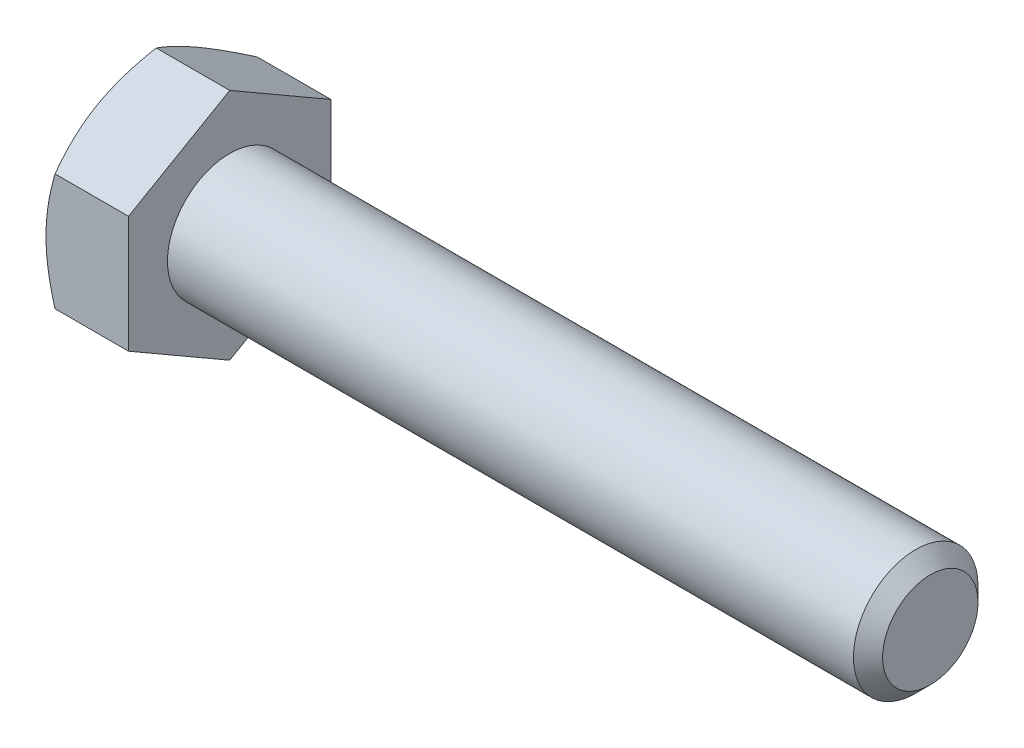
ISO-10303-21;
HEADER;
FILE_DESCRIPTION(('STEP AP214'),'2;1');
FILE_NAME('part.step','',(''),(''),'','','');
FILE_SCHEMA(('AUTOMOTIVE_DESIGN { 1 0 10303 214 1 1 1 1 }'));
ENDSEC;
DATA;
#1=APPLICATION_CONTEXT('core data for automotive mechanical design processes');
#2=APPLICATION_PROTOCOL_DEFINITION('international standard','automotive_design',2000,#1);
#3=PRODUCT_CONTEXT('',#1,'mechanical');
#4=PRODUCT('Part','Part','',(#3));
#5=PRODUCT_RELATED_PRODUCT_CATEGORY('part','',(#4));
#6=PRODUCT_DEFINITION_FORMATION('','',#4);
#7=PRODUCT_DEFINITION_CONTEXT('part definition',#1,'design');
#8=PRODUCT_DEFINITION('design','',#6,#7);
#9=PRODUCT_DEFINITION_SHAPE('','',#8);
#10=(LENGTH_UNIT() NAMED_UNIT(*) SI_UNIT(.MILLI.,.METRE.));
#11=(NAMED_UNIT(*) PLANE_ANGLE_UNIT() SI_UNIT($,.RADIAN.));
#12=(NAMED_UNIT(*) SI_UNIT($,.STERADIAN.) SOLID_ANGLE_UNIT());
#13=UNCERTAINTY_MEASURE_WITH_UNIT(LENGTH_MEASURE(1.E-05),#10,'distance_accuracy_value','');
#14=(GEOMETRIC_REPRESENTATION_CONTEXT(3) GLOBAL_UNCERTAINTY_ASSIGNED_CONTEXT((#13)) GLOBAL_UNIT_ASSIGNED_CONTEXT((#10,
#11,#12)) REPRESENTATION_CONTEXT('',''));
#15=CARTESIAN_POINT('',(0.,0.,0.));
#16=DIRECTION('',(0.,0.,1.));
#17=DIRECTION('',(1.,0.,0.));
#18=AXIS2_PLACEMENT_3D('',#15,#16,#17);
#19=CARTESIAN_POINT('',(-25.15,3.75277674973256,-6.5));
#20=DIRECTION('',(0.,0.,1.));
#21=DIRECTION('',(0.,-1.,0.));
#22=AXIS2_PLACEMENT_3D('',#19,#20,#21);
#23=PLANE('',#22);
#24=CARTESIAN_POINT('',(-21.8988375347904,-10.2428264448742,-6.5));
#25=CARTESIAN_POINT('',(-22.0378959568298,-9.95749123914051,-6.5));
#26=CARTESIAN_POINT('',(-22.1756670766775,-9.67151814089467,-6.5));
#27=CARTESIAN_POINT('',(-22.4479137007926,-9.09795746903658,-6.5));
#28=CARTESIAN_POINT('',(-22.5823887155004,-8.81036966330045,-6.5));
#29=CARTESIAN_POINT('',(-22.8479641385984,-8.23183597545905,-6.5));
#30=CARTESIAN_POINT('',(-22.9790435500319,-7.94088042259019,-6.5));
#31=CARTESIAN_POINT('',(-23.2360498001633,-7.35671087199066,-6.5));
#32=CARTESIAN_POINT('',(-23.3619768720535,-7.06349697718675,-6.5));
#33=CARTESIAN_POINT('',(-23.6114858396513,-6.4643492082911,-6.5));
#34=CARTESIAN_POINT('',(-23.7348431675994,-6.15832132148372,-6.5));
#35=CARTESIAN_POINT('',(-23.972608752086,-5.54274557657454,-6.5));
#36=CARTESIAN_POINT('',(-24.0870160276455,-5.23319733686813,-6.5));
#37=CARTESIAN_POINT('',(-24.3039973091502,-4.61061796093426,-6.5));
#38=CARTESIAN_POINT('',(-24.4065939138988,-4.29759477651377,-6.5));
#39=CARTESIAN_POINT('',(-24.5967687655389,-3.66705774167675,-6.5));
#40=CARTESIAN_POINT('',(-24.6843515728703,-3.34954528670966,-6.5));
#41=CARTESIAN_POINT('',(-24.8399427735025,-2.7116231594821,-6.5));
#42=CARTESIAN_POINT('',(-24.9080609404154,-2.39124068505769,-6.5));
#43=CARTESIAN_POINT('',(-25.0209643239007,-1.74628166899206,-6.5));
#44=CARTESIAN_POINT('',(-25.0657520879383,-1.4217055892218,-6.5));
#45=CARTESIAN_POINT('',(-25.1124703115096,-0.935153679865167,-6.5));
#46=CARTESIAN_POINT('',(-25.1246175505238,-0.774120709459425,-6.5));
#47=CARTESIAN_POINT('',(-25.1420902736854,-0.45167794746219,-6.5));
#48=CARTESIAN_POINT('',(-25.1474158757718,-0.290268162433766,-6.5));
#49=CARTESIAN_POINT('',(-25.1511103242405,0.0326315494834262,-6.5));
#50=CARTESIAN_POINT('',(-25.1494791334757,0.194121476795526,-6.5));
#51=CARTESIAN_POINT('',(-25.1393035354648,0.516885665892433,-6.5));
#52=CARTESIAN_POINT('',(-25.1307588135452,0.678159917525946,-6.5));
#53=CARTESIAN_POINT('',(-25.1024625394136,1.06087214104236,-6.5));
#54=CARTESIAN_POINT('',(-25.0797022251754,1.28209274970583,-6.5));
#55=CARTESIAN_POINT('',(-25.0223779071898,1.72298724409095,-6.5));
#56=CARTESIAN_POINT('',(-24.9878124366177,1.94266093413999,-6.5));
#57=CARTESIAN_POINT('',(-24.8682333769037,2.59905068849274,-6.5));
#58=CARTESIAN_POINT('',(-24.7673552447204,3.03292018726935,-6.5));
#59=CARTESIAN_POINT('',(-24.5911776385598,3.68203059846041,-6.5));
#60=CARTESIAN_POINT('',(-24.5274324340808,3.90060192791518,-6.5));
#61=CARTESIAN_POINT('',(-24.3930131704256,4.33562456943628,-6.5));
#62=CARTESIAN_POINT('',(-24.3223390575691,4.55207586506382,-6.5));
#63=CARTESIAN_POINT('',(-24.1752213498623,4.98292314894179,-6.5));
#64=CARTESIAN_POINT('',(-24.0987793659087,5.19731969234534,-6.5));
#65=CARTESIAN_POINT('',(-23.941056055445,5.62431367555165,-6.5));
#66=CARTESIAN_POINT('',(-23.8597748415995,5.83691115710786,-6.5));
#67=CARTESIAN_POINT('',(-23.6339612470781,6.41107024223244,-6.5));
#68=CARTESIAN_POINT('',(-23.4855374016011,6.7710999393646,-6.5));
#69=CARTESIAN_POINT('',(-23.1799136760887,7.4874289427614,-6.5));
#70=CARTESIAN_POINT('',(-23.0227128050824,7.84372782238265,-6.5));
#71=CARTESIAN_POINT('',(-22.7016207293392,8.55345570158046,-6.5));
#72=CARTESIAN_POINT('',(-22.5377269335731,8.90688352497398,-6.5));
#73=CARTESIAN_POINT('',(-22.204856755394,9.61131133342873,-6.5));
#74=CARTESIAN_POINT('',(-22.0358805841306,9.96231141860833,-6.5));
#75=CARTESIAN_POINT('',(-21.6936782330391,10.662937159309,-6.5));
#76=CARTESIAN_POINT('',(-21.5204455845689,11.012559648688,-6.5));
#77=CARTESIAN_POINT('',(-21.1708226067091,11.7102232163488,-6.5));
#78=CARTESIAN_POINT('',(-20.9944322504893,12.058264281162,-6.5));
#79=CARTESIAN_POINT('',(-20.6391563125904,12.7529700638115,-6.5));
#80=CARTESIAN_POINT('',(-20.4602713019335,13.099635074022,-6.5));
#81=CARTESIAN_POINT('',(-20.1004354194784,13.7918918665457,-6.5));
#82=CARTESIAN_POINT('',(-19.919484539364,14.1374836445314,-6.5));
#83=CARTESIAN_POINT('',(-19.4128202969978,15.099399814329,-6.5));
#84=CARTESIAN_POINT('',(-19.0852517304161,15.7147468097596,-6.5));
#85=CARTESIAN_POINT('',(-18.4261876636577,16.9433793144053,-6.5));
#86=CARTESIAN_POINT('',(-18.0946919178251,17.5566646915471,-6.5));
#87=CARTESIAN_POINT('',(-17.4299128254685,18.779571101851,-6.5));
#88=CARTESIAN_POINT('',(-17.0966393541487,19.3891975085091,-6.5));
#89=CARTESIAN_POINT('',(-16.4278601843398,20.6071616325274,-6.5));
#90=CARTESIAN_POINT('',(-16.0923546667948,21.2154994492026,-6.5));
#91=CARTESIAN_POINT('',(-15.7560387557676,21.8233856137376,-6.5));
#92=B_SPLINE_CURVE_WITH_KNOTS('',3,(#24,#25,#26,#27,#28,#29,#30,#31,#32,#33,#34,#35,#36,#37,#38,
#39,#40,#41,#42,#43,#44,#45,#46,#47,#48,#49,#50,#51,#52,#53,#54,#55,#56,#57,#58,#59,#60,#61,#62,
#63,#64,#65,#66,#67,#68,#69,#70,#71,#72,#73,#74,#75,#76,#77,#78,#79,#80,#81,#82,#83,#84,#85,#86,
#87,#88,#89,#90,#91),.UNSPECIFIED.,.F.,.F.,(4,2,2,2,2,2,2,2,2,2,2,2,2,2,2,2,2,2,2,2,2,2,2,2,2,2,
2,2,2,2,2,2,2,4),(0.,0.952261280954758,1.90466315142592,2.86198011748919,3.81925370781654,
4.8090096155403,5.79887385484699,6.78681142619052,7.77444837777728,8.75640022308114,
9.73824482580219,10.2225937503397,10.7069343008766,11.1912774376491,11.6756426208366,
12.3424346364353,13.0093095330214,14.3437044199063,15.0266742020638,15.7096492758005,
16.3924343039017,17.0752034419144,18.2433007736227,19.4115302572279,20.580216365918,
21.7488539878951,22.9193933559163,24.0899426744252,25.2602283161706,26.4305186706516,
28.5218066724742,30.6132261881502,32.6975528607151,34.7817125747728),.UNSPECIFIED.);
#93=CARTESIAN_POINT('',(-24.5694434163992,3.75277674973256,-6.5));
#94=VERTEX_POINT('',#93);
#95=CARTESIAN_POINT('',(-25.15,0.,-6.5));
#96=VERTEX_POINT('',#95);
#97=EDGE_CURVE('E235',#94,#96,#92,.F.);
#98=ORIENTED_EDGE('',*,*,#97,.F.);
#99=DIRECTION('',(1.,0.,0.));
#100=VECTOR('',#99,1.);
#101=CARTESIAN_POINT('',(-25.15,3.75277674973256,-6.5));
#102=LINE('',#101,#100);
#103=CARTESIAN_POINT('',(-19.85,3.75277674973256,-6.5));
#104=VERTEX_POINT('',#103);
#105=EDGE_CURVE('E262',#94,#104,#102,.T.);
#106=ORIENTED_EDGE('',*,*,#105,.T.);
#107=DIRECTION('',(0.,-1.,0.));
#108=VECTOR('',#107,1.);
#109=CARTESIAN_POINT('',(-19.85,3.75277674973256,-6.5));
#110=LINE('',#109,#108);
#111=CARTESIAN_POINT('',(-19.85,-3.75277674973257,-6.5));
#112=VERTEX_POINT('',#111);
#113=EDGE_CURVE('E241',#104,#112,#110,.T.);
#114=ORIENTED_EDGE('',*,*,#113,.T.);
#115=DIRECTION('',(1.,0.,0.));
#116=VECTOR('',#115,1.);
#117=CARTESIAN_POINT('',(-25.15,-3.75277674973257,-6.5));
#118=LINE('',#117,#116);
#119=CARTESIAN_POINT('',(-24.5694434163992,-3.75277674973257,-6.5));
#120=VERTEX_POINT('',#119);
#121=EDGE_CURVE('E218',#120,#112,#118,.T.);
#122=ORIENTED_EDGE('',*,*,#121,.F.);
#123=EDGE_CURVE('E159',#96,#120,#92,.F.);
#124=ORIENTED_EDGE('',*,*,#123,.F.);
#125=EDGE_LOOP('',(#98,#106,#114,#122,#124));
#126=FACE_BOUND('',#125,.T.);
#127=ADVANCED_FACE('F35',(#126),#23,.F.);
#128=CARTESIAN_POINT('',(-25.15,-3.75277674973257,-6.5));
#129=DIRECTION('',(0.,0.866025403784439,0.5));
#130=DIRECTION('',(0.,-0.5,0.866025403784439));
#131=AXIS2_PLACEMENT_3D('',#128,#129,#130);
#132=PLANE('',#131);
#133=CARTESIAN_POINT('',(-24.5693767481941,-3.75266127967873,-6.5002));
#134=CARTESIAN_POINT('',(-24.6169955769245,-3.83515161912751,-6.35732254094112));
#135=CARTESIAN_POINT('',(-24.6624532993973,-3.91794952254313,-6.21391236546509));
#136=CARTESIAN_POINT('',(-24.748451317977,-4.08421773795795,-5.92592736868281));
#137=CARTESIAN_POINT('',(-24.788989492772,-4.16768832359106,-5.78135207342874));
#138=CARTESIAN_POINT('',(-24.9024289988768,-4.41943655294052,-5.34531134947997));
#139=CARTESIAN_POINT('',(-24.9669521928713,-4.5887079340369,-5.05212471715368));
#140=CARTESIAN_POINT('',(-25.0426134164525,-4.84201947708215,-4.61337625445563));
#141=CARTESIAN_POINT('',(-25.064167143543,-4.92530276780316,-4.46912536350531));
#142=CARTESIAN_POINT('',(-25.1003096853939,-5.09224566542477,-4.17997178286191));
#143=CARTESIAN_POINT('',(-25.1148991155403,-5.17590523841628,-4.03506915190111));
#144=CARTESIAN_POINT('',(-25.1367412474927,-5.34336968579964,-3.74501222057168));
#145=CARTESIAN_POINT('',(-25.1440022756779,-5.427174286676,-3.59985839394579));
#146=CARTESIAN_POINT('',(-25.1510396974178,-5.59485627940484,-3.30942466302505));
#147=CARTESIAN_POINT('',(-25.1508163221878,-5.6787336689286,-3.16414476276364));
#148=CARTESIAN_POINT('',(-25.1399165414848,-5.90853103021317,-2.76612405757351));
#149=CARTESIAN_POINT('',(-25.1216181821306,-6.05437578112763,-2.51351353897243));
#150=CARTESIAN_POINT('',(-25.0635936585423,-6.34509659313135,-2.00997032176432));
#151=CARTESIAN_POINT('',(-25.0238476614618,-6.48997163178545,-1.75903939406692));
#152=CARTESIAN_POINT('',(-24.9244940967979,-6.78127752911039,-1.25448277935568));
#153=CARTESIAN_POINT('',(-24.864465574362,-6.92767163007068,-1.00092075856408));
#154=CARTESIAN_POINT('',(-24.7282250074901,-7.21827667013277,-0.497578064240953));
#155=CARTESIAN_POINT('',(-24.6520449658364,-7.36249133098589,-0.247790944447034));
#156=CARTESIAN_POINT('',(-24.5693767481941,-7.50566896951897,0.000200000000002895));
#157=B_SPLINE_CURVE_WITH_KNOTS('',3,(#133,#134,#135,#136,#137,#138,#139,#140,#141,#142,#143,
#144,#145,#146,#147,#148,#149,#150,#151,#152,#153,#154,#155,#156),.UNSPECIFIED.,.F.,.F.,(4,2,2,
2,2,2,2,2,2,2,2,4),(0.,0.515105052395588,1.03043143507525,2.06322554824262,2.56697389547996,
3.07067772176454,3.57380860368928,4.0769239424252,4.9527935470566,5.82947446853466,
6.72559912449736,7.61996451221046),.UNSPECIFIED.);
#158=CARTESIAN_POINT('',(-25.15,-5.62916512459885,-3.25));
#159=VERTEX_POINT('',#158);
#160=EDGE_CURVE('E240',#120,#159,#157,.T.);
#161=ORIENTED_EDGE('',*,*,#160,.F.);
#162=ORIENTED_EDGE('',*,*,#121,.T.);
#163=DIRECTION('',(0.,-0.5,0.866025403784439));
#164=VECTOR('',#163,1.);
#165=CARTESIAN_POINT('',(-19.85,-3.75277674973257,-6.5));
#166=LINE('',#165,#164);
#167=CARTESIAN_POINT('',(-19.85,-7.50555349946514,0.));
#168=VERTEX_POINT('',#167);
#169=EDGE_CURVE('E272',#112,#168,#166,.T.);
#170=ORIENTED_EDGE('',*,*,#169,.T.);
#171=DIRECTION('',(1.,0.,0.));
#172=VECTOR('',#171,1.);
#173=CARTESIAN_POINT('',(-25.15,-7.50555349946514,0.));
#174=LINE('',#173,#172);
#175=CARTESIAN_POINT('',(-24.5694434163992,-7.50555349946514,0.));
#176=VERTEX_POINT('',#175);
#177=EDGE_CURVE('E222',#176,#168,#174,.T.);
#178=ORIENTED_EDGE('',*,*,#177,.F.);
#179=EDGE_CURVE('E178',#159,#176,#157,.T.);
#180=ORIENTED_EDGE('',*,*,#179,.F.);
#181=EDGE_LOOP('',(#161,#162,#170,#178,#180));
#182=FACE_BOUND('',#181,.T.);
#183=ADVANCED_FACE('F188',(#182),#132,.F.);
#184=CARTESIAN_POINT('',(-25.15,-7.50555349946514,0.));
#185=DIRECTION('',(0.,0.866025403784439,-0.5));
#186=DIRECTION('',(0.,0.5,0.866025403784439));
#187=AXIS2_PLACEMENT_3D('',#184,#185,#186);
#188=PLANE('',#187);
#189=CARTESIAN_POINT('',(-24.5693767481941,-7.50566896951897,-0.000199999999996506));
#190=CARTESIAN_POINT('',(-24.6169955769245,-7.4231786300702,0.142677459058884));
#191=CARTESIAN_POINT('',(-24.6624532993973,-7.34038072665458,0.286087634534916));
#192=CARTESIAN_POINT('',(-24.748451317977,-7.17411251123976,0.574072631317198));
#193=CARTESIAN_POINT('',(-24.788989492772,-7.09064192560665,0.718647926571267));
#194=CARTESIAN_POINT('',(-24.9024289988768,-6.83889369625719,1.15468865052004));
#195=CARTESIAN_POINT('',(-24.9669521928713,-6.66962231516081,1.44787528284632));
#196=CARTESIAN_POINT('',(-25.0426134164525,-6.41631077211555,1.88662374554438));
#197=CARTESIAN_POINT('',(-25.064167143543,-6.33302748139454,2.03087463649469));
#198=CARTESIAN_POINT('',(-25.1003096853939,-6.16608458377293,2.32002821713809));
#199=CARTESIAN_POINT('',(-25.1148991155403,-6.08242501078143,2.46493084809889));
#200=CARTESIAN_POINT('',(-25.1367412474927,-5.91496056339806,2.75498777942832));
#201=CARTESIAN_POINT('',(-25.1440022756779,-5.8311559625217,2.90014160605421));
#202=CARTESIAN_POINT('',(-25.1510396974178,-5.66347396979287,3.19057533697495));
#203=CARTESIAN_POINT('',(-25.1508163221878,-5.5795965802691,3.33585523723636));
#204=CARTESIAN_POINT('',(-25.1399165414848,-5.34979921898453,3.7338759424265));
#205=CARTESIAN_POINT('',(-25.1216181821306,-5.20395446807007,3.98648646102757));
#206=CARTESIAN_POINT('',(-25.0635936585423,-4.91323365606636,4.49002967823568));
#207=CARTESIAN_POINT('',(-25.0238476614618,-4.76835861741226,4.74096060593309));
#208=CARTESIAN_POINT('',(-24.9244940967978,-4.47705272008732,5.24551722064432));
#209=CARTESIAN_POINT('',(-24.864465574362,-4.33065861912703,5.49907924143591));
#210=CARTESIAN_POINT('',(-24.7282250074901,-4.04005357906494,6.00242193575905));
#211=CARTESIAN_POINT('',(-24.6520449658364,-3.89583891821182,6.25220905555297));
#212=CARTESIAN_POINT('',(-24.5693767481941,-3.75266127967873,6.5002));
#213=B_SPLINE_CURVE_WITH_KNOTS('',3,(#189,#190,#191,#192,#193,#194,#195,#196,#197,#198,#199,
#200,#201,#202,#203,#204,#205,#206,#207,#208,#209,#210,#211,#212),.UNSPECIFIED.,.F.,.F.,(4,2,2,
2,2,2,2,2,2,2,2,4),(0.,0.515105052395587,1.03043143507524,2.06322554824262,2.56697389547996,
3.07067772176454,3.57380860368928,4.0769239424252,4.9527935470566,5.82947446853466,
6.72559912449736,7.61996451221045),.UNSPECIFIED.);
#214=CARTESIAN_POINT('',(-25.15,-5.62916512459885,3.25));
#215=VERTEX_POINT('',#214);
#216=EDGE_CURVE('E176',#176,#215,#213,.T.);
#217=ORIENTED_EDGE('',*,*,#216,.F.);
#218=ORIENTED_EDGE('',*,*,#177,.T.);
#219=DIRECTION('',(0.,0.5,0.866025403784439));
#220=VECTOR('',#219,1.);
#221=CARTESIAN_POINT('',(-19.85,-7.50555349946514,0.));
#222=LINE('',#221,#220);
#223=CARTESIAN_POINT('',(-19.85,-3.75277674973257,6.5));
#224=VERTEX_POINT('',#223);
#225=EDGE_CURVE('E255',#168,#224,#222,.T.);
#226=ORIENTED_EDGE('',*,*,#225,.T.);
#227=DIRECTION('',(1.,0.,0.));
#228=VECTOR('',#227,1.);
#229=CARTESIAN_POINT('',(-25.15,-3.75277674973257,6.5));
#230=LINE('',#229,#228);
#231=CARTESIAN_POINT('',(-24.5694434163994,-3.75277674973285,6.5));
#232=VERTEX_POINT('',#231);
#233=EDGE_CURVE('E252',#232,#224,#230,.T.);
#234=ORIENTED_EDGE('',*,*,#233,.F.);
#235=EDGE_CURVE('E170',#215,#232,#213,.T.);
#236=ORIENTED_EDGE('',*,*,#235,.F.);
#237=EDGE_LOOP('',(#217,#218,#226,#234,#236));
#238=FACE_BOUND('',#237,.T.);
#239=ADVANCED_FACE('F184',(#238),#188,.F.);
#240=CARTESIAN_POINT('',(-25.15,-3.75277674973257,6.5));
#241=DIRECTION('',(0.,0.,-1.));
#242=DIRECTION('',(0.,1.,0.));
#243=AXIS2_PLACEMENT_3D('',#240,#241,#242);
#244=PLANE('',#243);
#245=CARTESIAN_POINT('',(-21.898837531364,-10.242826451903,6.5));
#246=CARTESIAN_POINT('',(-22.0378959535461,-9.9574912459326,6.5));
#247=CARTESIAN_POINT('',(-22.1756670735365,-9.67151814744991,6.5));
#248=CARTESIAN_POINT('',(-22.4479136979362,-9.09795747511739,6.5));
#249=CARTESIAN_POINT('',(-22.582388712786,-8.81036966914369,6.5));
#250=CARTESIAN_POINT('',(-22.8479641361679,-8.2318359808236,6.5));
#251=CARTESIAN_POINT('',(-22.9790435477435,-7.9408804277136,6.5));
#252=CARTESIAN_POINT('',(-23.2360497981565,-7.35671087663017,6.5));
#253=CARTESIAN_POINT('',(-23.3619768701864,-7.0634969815835,6.5));
#254=CARTESIAN_POINT('',(-23.6114858380679,-6.46434921218302,6.5));
#255=CARTESIAN_POINT('',(-23.7348431661597,-6.15832132511338,6.5));
#256=CARTESIAN_POINT('',(-23.972608750926,-5.54274557967553,6.5));
#257=CARTESIAN_POINT('',(-24.0870160266216,-5.23319733970269,6.5));
#258=CARTESIAN_POINT('',(-24.3039973083856,-4.61061796323105,6.5));
#259=CARTESIAN_POINT('',(-24.4065939132575,-4.29759477853923,6.5));
#260=CARTESIAN_POINT('',(-24.5967687651243,-3.66705774315221,6.5));
#261=CARTESIAN_POINT('',(-24.6843515725591,-3.34954528790644,6.5));
#262=CARTESIAN_POINT('',(-24.8399427734003,-2.71162315998017,6.5));
#263=CARTESIAN_POINT('',(-24.9080609404108,-2.39124068513379,6.5));
#264=CARTESIAN_POINT('',(-25.0209643240282,-1.74628166821368,6.5));
#265=CARTESIAN_POINT('',(-25.0657520881001,-1.42170558801091,6.5));
#266=CARTESIAN_POINT('',(-25.1124703116654,-0.935153678008447,6.5));
#267=CARTESIAN_POINT('',(-25.1246175506682,-0.774120707390587,6.5));
#268=CARTESIAN_POINT('',(-25.1420902737883,-0.45167794496943,6.5));
#269=CARTESIAN_POINT('',(-25.1474158758445,-0.290268159729203,6.5));
#270=CARTESIAN_POINT('',(-25.1511103242345,0.032631552610058,6.5));
#271=CARTESIAN_POINT('',(-25.1494791334211,0.194121480132423,6.5));
#272=CARTESIAN_POINT('',(-25.1393035352959,0.516885669647161,6.5));
#273=CARTESIAN_POINT('',(-25.1307588133104,0.67815992148824,6.5));
#274=CARTESIAN_POINT('',(-25.1024625390171,1.06087214532241,6.5));
#275=CARTESIAN_POINT('',(-25.0797022246861,1.28209275409517,6.5));
#276=CARTESIAN_POINT('',(-25.0223779065099,1.72298724869384,6.5));
#277=CARTESIAN_POINT('',(-24.98781243584,1.94266093884714,6.5));
#278=CARTESIAN_POINT('',(-24.8682333758306,2.59905069350689,6.5));
#279=CARTESIAN_POINT('',(-24.7673552434479,3.03292019247994,6.5));
#280=CARTESIAN_POINT('',(-24.5911776369932,3.68203060396479,6.5));
#281=CARTESIAN_POINT('',(-24.5274324324155,3.90060193351963,6.5));
#282=CARTESIAN_POINT('',(-24.393013168566,4.33562457523974,6.5));
#283=CARTESIAN_POINT('',(-24.3223390556138,4.5520758709662,6.5));
#284=CARTESIAN_POINT('',(-24.1752213477193,4.98292315504125,6.5));
#285=CARTESIAN_POINT('',(-24.0987793636737,5.19731969854296,6.5));
#286=CARTESIAN_POINT('',(-23.941056053029,5.6243136819456,6.5));
#287=CARTESIAN_POINT('',(-23.8597748390948,5.83691116359998,6.5));
#288=CARTESIAN_POINT('',(-23.6339612444198,6.41107024877938,6.5));
#289=CARTESIAN_POINT('',(-23.485537398888,6.77109994587115,6.5));
#290=CARTESIAN_POINT('',(-23.179913673282,7.48742894919241,6.5));
#291=CARTESIAN_POINT('',(-23.0227128022369,7.84372782877851,6.5));
#292=CARTESIAN_POINT('',(-22.7016207264276,8.55345570790977,6.5));
#293=CARTESIAN_POINT('',(-22.5377269306343,8.90688353127188,6.5));
#294=CARTESIAN_POINT('',(-22.2048567524088,9.61131133966724,6.5));
#295=CARTESIAN_POINT('',(-22.0358805811264,9.96231142481885,6.5));
#296=CARTESIAN_POINT('',(-21.6936782300035,10.6629371654643,6.5));
#297=CARTESIAN_POINT('',(-21.5204455815211,11.0125596548161,6.5));
#298=CARTESIAN_POINT('',(-21.1708226036412,11.7102232224246,6.5));
#299=CARTESIAN_POINT('',(-20.9944322474136,12.0582642872127,6.5));
#300=CARTESIAN_POINT('',(-20.6391563095022,12.7529700698137,6.5));
#301=CARTESIAN_POINT('',(-20.4602712988407,13.0996350800009,6.5));
#302=CARTESIAN_POINT('',(-20.1004354163791,13.7918918724793,6.5));
#303=CARTESIAN_POINT('',(-19.9194845362626,14.1374836504429,6.5));
#304=CARTESIAN_POINT('',(-19.4128202938739,15.0993998202175,6.5));
#305=CARTESIAN_POINT('',(-19.0852517272737,15.7147468156481,6.5));
#306=CARTESIAN_POINT('',(-18.4261876604819,16.9433793202954,6.5));
#307=CARTESIAN_POINT('',(-18.0946919146346,17.5566646974389,6.5));
#308=CARTESIAN_POINT('',(-17.4299128222475,18.7795711077538,6.5));
#309=CARTESIAN_POINT('',(-17.0966393509119,19.3891975144212,6.5));
#310=CARTESIAN_POINT('',(-16.4278601810733,20.6071616384594,6.5));
#311=CARTESIAN_POINT('',(-16.0923546635142,21.215499455145,6.5));
#312=CARTESIAN_POINT('',(-15.7560387524736,21.8233856196907,6.5));
#313=B_SPLINE_CURVE_WITH_KNOTS('',3,(#245,#246,#247,#248,#249,#250,#251,#252,#253,#254,#255,
#256,#257,#258,#259,#260,#261,#262,#263,#264,#265,#266,#267,#268,#269,#270,#271,#272,#273,#274,
#275,#276,#277,#278,#279,#280,#281,#282,#283,#284,#285,#286,#287,#288,#289,#290,#291,#292,#293,
#294,#295,#296,#297,#298,#299,#300,#301,#302,#303,#304,#305,#306,#307,#308,#309,#310,#311,#312),
.UNSPECIFIED.,.F.,.F.,(4,2,2,2,2,2,2,2,2,2,2,2,2,2,2,2,2,2,2,2,2,2,2,2,2,2,2,2,2,2,2,2,2,4),(0.,
0.952261281780652,1.90466315307783,2.86198011997567,3.81925371113752,4.80900961975205,
5.79887385994981,6.78681143218155,7.77444838465583,8.75640023125627,9.73824483527201,
10.222593760441,10.7069343116093,11.1912774490135,11.6756426328327,12.3424346487859,
13.0093095457265,14.343704433322,15.0266742158507,15.7096492899588,16.3924343184303,
17.0752034568132,18.2433007884729,19.4115302720289,20.5802163806681,21.7488540025943,
22.9193933705589,24.0899426890111,25.2602283307008,26.4305186851261,28.5218066869747,
30.6132262026763,32.6975528752884,34.7817125893938),.UNSPECIFIED.);
#314=CARTESIAN_POINT('',(-25.15,0.,6.5));
#315=VERTEX_POINT('',#314);
#316=EDGE_CURVE('E177',#232,#315,#313,.T.);
#317=ORIENTED_EDGE('',*,*,#316,.F.);
#318=ORIENTED_EDGE('',*,*,#233,.T.);
#319=DIRECTION('',(0.,1.,0.));
#320=VECTOR('',#319,1.);
#321=CARTESIAN_POINT('',(-19.85,-3.75277674973257,6.5));
#322=LINE('',#321,#320);
#323=CARTESIAN_POINT('',(-19.85,3.75277674973257,6.5));
#324=VERTEX_POINT('',#323);
#325=EDGE_CURVE('E269',#224,#324,#322,.T.);
#326=ORIENTED_EDGE('',*,*,#325,.T.);
#327=DIRECTION('',(1.,0.,0.));
#328=VECTOR('',#327,1.);
#329=CARTESIAN_POINT('',(-25.15,3.75277674973257,6.5));
#330=LINE('',#329,#328);
#331=CARTESIAN_POINT('',(-24.5694434163992,3.75277674973257,6.5));
#332=VERTEX_POINT('',#331);
#333=EDGE_CURVE('E257',#332,#324,#330,.T.);
#334=ORIENTED_EDGE('',*,*,#333,.F.);
#335=EDGE_CURVE('E107',#315,#332,#313,.T.);
#336=ORIENTED_EDGE('',*,*,#335,.F.);
#337=EDGE_LOOP('',(#317,#318,#326,#334,#336));
#338=FACE_BOUND('',#337,.T.);
#339=ADVANCED_FACE('F187',(#338),#244,.F.);
#340=CARTESIAN_POINT('',(-25.15,3.75277674973257,6.5));
#341=DIRECTION('',(0.,-0.866025403784439,-0.5));
#342=DIRECTION('',(0.,0.5,-0.866025403784439));
#343=AXIS2_PLACEMENT_3D('',#340,#341,#342);
#344=PLANE('',#343);
#345=CARTESIAN_POINT('',(-24.5693767481941,3.75266127967873,6.5002));
#346=CARTESIAN_POINT('',(-24.6169955769245,3.8351516191275,6.35732254094112));
#347=CARTESIAN_POINT('',(-24.6624532993973,3.91794952254312,6.21391236546509));
#348=CARTESIAN_POINT('',(-24.748451317977,4.08421773795795,5.9259273686828));
#349=CARTESIAN_POINT('',(-24.788989492772,4.16768832359105,5.78135207342874));
#350=CARTESIAN_POINT('',(-24.9024289988768,4.41943655294051,5.34531134947996));
#351=CARTESIAN_POINT('',(-24.9669521928713,4.58870793403689,5.05212471715368));
#352=CARTESIAN_POINT('',(-25.0426134164525,4.84201947708215,4.61337625445563));
#353=CARTESIAN_POINT('',(-25.064167143543,4.92530276780316,4.46912536350531));
#354=CARTESIAN_POINT('',(-25.1003096853939,5.09224566542477,4.17997178286191));
#355=CARTESIAN_POINT('',(-25.1148991155403,5.17590523841627,4.03506915190111));
#356=CARTESIAN_POINT('',(-25.1367412474927,5.34336968579964,3.74501222057168));
#357=CARTESIAN_POINT('',(-25.1440022756779,5.427174286676,3.59985839394579));
#358=CARTESIAN_POINT('',(-25.1510396974178,5.59485627940483,3.30942466302505));
#359=CARTESIAN_POINT('',(-25.1508163221878,5.6787336689286,3.16414476276364));
#360=CARTESIAN_POINT('',(-25.1399165414848,5.90853103021317,2.7661240575735));
#361=CARTESIAN_POINT('',(-25.1216181821306,6.05437578112763,2.51351353897243));
#362=CARTESIAN_POINT('',(-25.0635936585423,6.34509659313134,2.00997032176432));
#363=CARTESIAN_POINT('',(-25.0238476614618,6.48997163178544,1.75903939406692));
#364=CARTESIAN_POINT('',(-24.9244940967979,6.78127752911038,1.25448277935568));
#365=CARTESIAN_POINT('',(-24.864465574362,6.92767163007067,1.00092075856409));
#366=CARTESIAN_POINT('',(-24.7282250074901,7.21827667013276,0.497578064240955));
#367=CARTESIAN_POINT('',(-24.6520449658364,7.36249133098589,0.247790944447036));
#368=CARTESIAN_POINT('',(-24.5693767481941,7.50566896951897,-0.000200000000000316));
#369=B_SPLINE_CURVE_WITH_KNOTS('',3,(#345,#346,#347,#348,#349,#350,#351,#352,#353,#354,#355,
#356,#357,#358,#359,#360,#361,#362,#363,#364,#365,#366,#367,#368),.UNSPECIFIED.,.F.,.F.,(4,2,2,
2,2,2,2,2,2,2,2,4),(0.,0.515105052395588,1.03043143507525,2.06322554824262,2.56697389547996,
3.07067772176454,3.57380860368928,4.0769239424252,4.9527935470566,5.82947446853466,
6.72559912449736,7.61996451221046),.UNSPECIFIED.);
#370=CARTESIAN_POINT('',(-25.15,5.62916512459885,3.25));
#371=VERTEX_POINT('',#370);
#372=EDGE_CURVE('E104',#332,#371,#369,.T.);
#373=ORIENTED_EDGE('',*,*,#372,.F.);
#374=ORIENTED_EDGE('',*,*,#333,.T.);
#375=DIRECTION('',(0.,0.5,-0.866025403784439));
#376=VECTOR('',#375,1.);
#377=CARTESIAN_POINT('',(-19.85,3.75277674973257,6.5));
#378=LINE('',#377,#376);
#379=CARTESIAN_POINT('',(-19.85,7.50555349946513,0.));
#380=VERTEX_POINT('',#379);
#381=EDGE_CURVE('E267',#324,#380,#378,.T.);
#382=ORIENTED_EDGE('',*,*,#381,.T.);
#383=DIRECTION('',(1.,0.,0.));
#384=VECTOR('',#383,1.);
#385=CARTESIAN_POINT('',(-25.15,7.50555349946513,0.));
#386=LINE('',#385,#384);
#387=CARTESIAN_POINT('',(-24.5694434163992,7.50555349946513,0.));
#388=VERTEX_POINT('',#387);
#389=EDGE_CURVE('E128',#388,#380,#386,.T.);
#390=ORIENTED_EDGE('',*,*,#389,.F.);
#391=EDGE_CURVE('E111',#371,#388,#369,.T.);
#392=ORIENTED_EDGE('',*,*,#391,.F.);
#393=EDGE_LOOP('',(#373,#374,#382,#390,#392));
#394=FACE_BOUND('',#393,.T.);
#395=ADVANCED_FACE('F126',(#394),#344,.F.);
#396=CARTESIAN_POINT('',(-25.15,7.50555349946513,0.));
#397=DIRECTION('',(0.,-0.866025403784439,0.5));
#398=DIRECTION('',(0.,-0.5,-0.866025403784439));
#399=AXIS2_PLACEMENT_3D('',#396,#397,#398);
#400=PLANE('',#399);
#401=CARTESIAN_POINT('',(-24.5693767481941,7.50566896951897,0.000199999999999783));
#402=CARTESIAN_POINT('',(-24.6169955769245,7.4231786300702,-0.14267745905888));
#403=CARTESIAN_POINT('',(-24.6624532993973,7.34038072665458,-0.286087634534913));
#404=CARTESIAN_POINT('',(-24.748451317977,7.17411251123975,-0.574072631317195));
#405=CARTESIAN_POINT('',(-24.788989492772,7.09064192560665,-0.718647926571264));
#406=CARTESIAN_POINT('',(-24.9024289988768,6.83889369625718,-1.15468865052003));
#407=CARTESIAN_POINT('',(-24.9669521928713,6.6696223151608,-1.44787528284632));
#408=CARTESIAN_POINT('',(-25.0426134164525,6.41631077211555,-1.88662374554437));
#409=CARTESIAN_POINT('',(-25.064167143543,6.33302748139454,-2.03087463649469));
#410=CARTESIAN_POINT('',(-25.1003096853939,6.16608458377293,-2.32002821713809));
#411=CARTESIAN_POINT('',(-25.1148991155403,6.08242501078143,-2.46493084809889));
#412=CARTESIAN_POINT('',(-25.1367412474927,5.91496056339806,-2.75498777942832));
#413=CARTESIAN_POINT('',(-25.1440022756779,5.8311559625217,-2.90014160605421));
#414=CARTESIAN_POINT('',(-25.1510396974178,5.66347396979286,-3.19057533697495));
#415=CARTESIAN_POINT('',(-25.1508163221878,5.5795965802691,-3.33585523723636));
#416=CARTESIAN_POINT('',(-25.1399165414848,5.34979921898453,-3.73387594242649));
#417=CARTESIAN_POINT('',(-25.1216181821306,5.20395446807007,-3.98648646102757));
#418=CARTESIAN_POINT('',(-25.0635936585423,4.91323365606635,-4.49002967823568));
#419=CARTESIAN_POINT('',(-25.0238476614618,4.76835861741226,-4.74096060593308));
#420=CARTESIAN_POINT('',(-24.9244940967979,4.47705272008731,-5.24551722064432));
#421=CARTESIAN_POINT('',(-24.864465574362,4.33065861912702,-5.49907924143592));
#422=CARTESIAN_POINT('',(-24.7282250074901,4.04005357906493,-6.00242193575905));
#423=CARTESIAN_POINT('',(-24.6520449658364,3.89583891821181,-6.25220905555297));
#424=CARTESIAN_POINT('',(-24.5693767481941,3.75266127967873,-6.5002));
#425=B_SPLINE_CURVE_WITH_KNOTS('',3,(#401,#402,#403,#404,#405,#406,#407,#408,#409,#410,#411,
#412,#413,#414,#415,#416,#417,#418,#419,#420,#421,#422,#423,#424),.UNSPECIFIED.,.F.,.F.,(4,2,2,
2,2,2,2,2,2,2,2,4),(0.,0.515105052395588,1.03043143507524,2.06322554824262,2.56697389547997,
3.07067772176454,3.57380860368928,4.0769239424252,4.9527935470566,5.82947446853467,
6.72559912449737,7.61996451221046),.UNSPECIFIED.);
#426=CARTESIAN_POINT('',(-25.15,5.62916512459885,-3.25));
#427=VERTEX_POINT('',#426);
#428=EDGE_CURVE('E117',#388,#427,#425,.T.);
#429=ORIENTED_EDGE('',*,*,#428,.F.);
#430=ORIENTED_EDGE('',*,*,#389,.T.);
#431=DIRECTION('',(0.,-0.5,-0.866025403784439));
#432=VECTOR('',#431,1.);
#433=CARTESIAN_POINT('',(-19.85,7.50555349946513,0.));
#434=LINE('',#433,#432);
#435=EDGE_CURVE('E264',#380,#104,#434,.T.);
#436=ORIENTED_EDGE('',*,*,#435,.T.);
#437=ORIENTED_EDGE('',*,*,#105,.F.);
#438=EDGE_CURVE('E123',#427,#94,#425,.T.);
#439=ORIENTED_EDGE('',*,*,#438,.F.);
#440=EDGE_LOOP('',(#429,#430,#436,#437,#439));
#441=FACE_BOUND('',#440,.T.);
#442=ADVANCED_FACE('F203',(#441),#400,.F.);
#443=CARTESIAN_POINT('',(-19.85,0.,0.));
#444=DIRECTION('',(1.,0.,0.));
#445=DIRECTION('',(0.,0.,-1.));
#446=AXIS2_PLACEMENT_3D('',#443,#444,#445);
#447=CYLINDRICAL_SURFACE('',#446,4.);
#448=CARTESIAN_POINT('',(24.2125,0.,0.));
#449=DIRECTION('',(1.,0.,0.));
#450=DIRECTION('',(0.,0.,-1.));
#451=AXIS2_PLACEMENT_3D('',#448,#449,#450);
#452=CIRCLE('',#451,4.);
#453=CARTESIAN_POINT('',(24.2125,0.,-4.));
#454=VERTEX_POINT('',#453);
#455=EDGE_CURVE('E212',#454,#454,#452,.F.);
#456=CARTESIAN_POINT('',(-19.85,0.,0.));
#457=DIRECTION('',(-1.,0.,0.));
#458=DIRECTION('',(0.,0.,1.));
#459=AXIS2_PLACEMENT_3D('',#456,#457,#458);
#460=CIRCLE('',#459,4.);
#461=CARTESIAN_POINT('',(-19.85,0.,-4.));
#462=VERTEX_POINT('',#461);
#463=EDGE_CURVE('E215',#462,#462,#460,.F.);
#464=CARTESIAN_POINT('',(24.2125,0.,-4.));
#465=CARTESIAN_POINT('',(23.753515625,0.,-4.));
#466=CARTESIAN_POINT('',(23.29453125,0.,-4.));
#467=CARTESIAN_POINT('',(22.3765625,0.,-4.));
#468=CARTESIAN_POINT('',(21.917578125,0.,-4.));
#469=CARTESIAN_POINT('',(20.999609375,0.,-4.));
#470=CARTESIAN_POINT('',(20.540625,0.,-4.));
#471=CARTESIAN_POINT('',(19.62265625,0.,-4.));
#472=CARTESIAN_POINT('',(19.163671875,0.,-4.));
#473=CARTESIAN_POINT('',(18.245703125,0.,-4.));
#474=CARTESIAN_POINT('',(17.78671875,0.,-4.));
#475=CARTESIAN_POINT('',(16.86875,0.,-4.));
#476=CARTESIAN_POINT('',(16.409765625,0.,-4.));
#477=CARTESIAN_POINT('',(15.491796875,0.,-4.));
#478=CARTESIAN_POINT('',(15.0328125,0.,-4.));
#479=CARTESIAN_POINT('',(14.11484375,0.,-4.));
#480=CARTESIAN_POINT('',(13.655859375,0.,-4.));
#481=CARTESIAN_POINT('',(12.737890625,0.,-4.));
#482=CARTESIAN_POINT('',(12.27890625,0.,-4.));
#483=CARTESIAN_POINT('',(11.3609375,0.,-4.));
#484=CARTESIAN_POINT('',(10.901953125,0.,-4.));
#485=CARTESIAN_POINT('',(9.983984375,0.,-4.));
#486=CARTESIAN_POINT('',(9.525,0.,-4.));
#487=CARTESIAN_POINT('',(8.60703125,0.,-4.));
#488=CARTESIAN_POINT('',(8.148046875,0.,-4.));
#489=CARTESIAN_POINT('',(7.230078125,0.,-4.));
#490=CARTESIAN_POINT('',(6.77109375,0.,-4.));
#491=CARTESIAN_POINT('',(5.853125,0.,-4.));
#492=CARTESIAN_POINT('',(5.394140625,0.,-4.));
#493=CARTESIAN_POINT('',(4.476171875,0.,-4.));
#494=CARTESIAN_POINT('',(4.0171875,0.,-4.));
#495=CARTESIAN_POINT('',(3.09921875,0.,-4.));
#496=CARTESIAN_POINT('',(2.640234375,0.,-4.));
#497=CARTESIAN_POINT('',(1.722265625,0.,-4.));
#498=CARTESIAN_POINT('',(1.26328125,0.,-4.));
#499=CARTESIAN_POINT('',(0.345312499999999,0.,-4.));
#500=CARTESIAN_POINT('',(-0.113671875000001,0.,-4.));
#501=CARTESIAN_POINT('',(-1.031640625,0.,-4.));
#502=CARTESIAN_POINT('',(-1.490625,0.,-4.));
#503=CARTESIAN_POINT('',(-2.40859375,0.,-4.));
#504=CARTESIAN_POINT('',(-2.867578125,0.,-4.));
#505=CARTESIAN_POINT('',(-3.785546875,0.,-4.));
#506=CARTESIAN_POINT('',(-4.24453125,0.,-4.));
#507=CARTESIAN_POINT('',(-5.1625,0.,-4.));
#508=CARTESIAN_POINT('',(-5.621484375,0.,-4.));
#509=CARTESIAN_POINT('',(-6.539453125,0.,-4.));
#510=CARTESIAN_POINT('',(-6.9984375,0.,-4.));
#511=CARTESIAN_POINT('',(-7.91640625,0.,-4.));
#512=CARTESIAN_POINT('',(-8.375390625,0.,-4.));
#513=CARTESIAN_POINT('',(-9.293359375,0.,-4.));
#514=CARTESIAN_POINT('',(-9.75234375,0.,-4.));
#515=CARTESIAN_POINT('',(-10.6703125,0.,-4.));
#516=CARTESIAN_POINT('',(-11.129296875,0.,-4.));
#517=CARTESIAN_POINT('',(-12.047265625,0.,-4.));
#518=CARTESIAN_POINT('',(-12.50625,0.,-4.));
#519=CARTESIAN_POINT('',(-13.42421875,0.,-4.));
#520=CARTESIAN_POINT('',(-13.883203125,0.,-4.));
#521=CARTESIAN_POINT('',(-14.801171875,0.,-4.));
#522=CARTESIAN_POINT('',(-15.26015625,0.,-4.));
#523=CARTESIAN_POINT('',(-16.178125,0.,-4.));
#524=CARTESIAN_POINT('',(-16.637109375,0.,-4.));
#525=CARTESIAN_POINT('',(-17.555078125,0.,-4.));
#526=CARTESIAN_POINT('',(-18.0140625,0.,-4.));
#527=CARTESIAN_POINT('',(-18.93203125,0.,-4.));
#528=CARTESIAN_POINT('',(-19.391015625,0.,-4.));
#529=CARTESIAN_POINT('',(-19.85,0.,-4.));
#530=B_SPLINE_CURVE_WITH_KNOTS('',3,(#464,#465,#466,#467,#468,#469,#470,#471,#472,#473,#474,
#475,#476,#477,#478,#479,#480,#481,#482,#483,#484,#485,#486,#487,#488,#489,#490,#491,#492,#493,
#494,#495,#496,#497,#498,#499,#500,#501,#502,#503,#504,#505,#506,#507,#508,#509,#510,#511,#512,
#513,#514,#515,#516,#517,#518,#519,#520,#521,#522,#523,#524,#525,#526,#527,#528,#529),
.UNSPECIFIED.,.F.,.F.,(4,2,2,2,2,2,2,2,2,2,2,2,2,2,2,2,2,2,2,2,2,2,2,2,2,2,2,2,2,2,2,2,4),(0.,
1.376953125,2.75390625,4.130859375,5.5078125,6.884765625,8.26171875,9.638671875,11.015625,
12.392578125,13.76953125,15.146484375,16.5234375,17.900390625,19.27734375,20.654296875,22.03125,
23.408203125,24.78515625,26.162109375,27.5390625,28.916015625,30.29296875,31.669921875,
33.046875,34.423828125,35.80078125,37.177734375,38.5546875,39.931640625,41.30859375,
42.685546875,44.0625),.UNSPECIFIED.);
#531=EDGE_CURVE('BSEAM200',#454,#462,#530,.T.);
#532=ORIENTED_EDGE('',*,*,#455,.T.);
#533=ORIENTED_EDGE('',*,*,#463,.T.);
#534=ORIENTED_EDGE('',*,*,#531,.T.);
#535=ORIENTED_EDGE('',*,*,#531,.F.);
#536=EDGE_LOOP('',(#532,#534,#533,#535));
#537=FACE_BOUND('',#536,.T.);
#538=ADVANCED_FACE('F200',(#537),#447,.T.);
#539=CARTESIAN_POINT('',(25.15,0.,0.));
#540=DIRECTION('',(1.,0.,0.));
#541=DIRECTION('',(0.,0.,-1.));
#542=AXIS2_PLACEMENT_3D('',#539,#540,#541);
#543=PLANE('',#542);
#544=CARTESIAN_POINT('',(25.15,0.,0.));
#545=DIRECTION('',(1.,0.,0.));
#546=DIRECTION('',(0.,0.,-1.));
#547=AXIS2_PLACEMENT_3D('',#544,#545,#546);
#548=CIRCLE('',#547,3.0625);
#549=CARTESIAN_POINT('',(25.15,0.,-3.0625));
#550=VERTEX_POINT('',#549);
#551=EDGE_CURVE('E217',#550,#550,#548,.T.);
#552=ORIENTED_EDGE('',*,*,#551,.T.);
#553=EDGE_LOOP('',(#552));
#554=FACE_BOUND('',#553,.T.);
#555=ADVANCED_FACE('F198',(#554),#543,.T.);
#556=CARTESIAN_POINT('',(25.15,0.,0.));
#557=DIRECTION('',(-1.,0.,0.));
#558=DIRECTION('',(0.,0.,1.));
#559=AXIS2_PLACEMENT_3D('',#556,#557,#558);
#560=CONICAL_SURFACE('',#559,3.0625,0.785398163397451);
#561=ORIENTED_EDGE('',*,*,#455,.F.);
#562=EDGE_LOOP('',(#561));
#563=FACE_BOUND('',#562,.T.);
#564=ORIENTED_EDGE('',*,*,#551,.F.);
#565=EDGE_LOOP('',(#564));
#566=FACE_BOUND('',#565,.T.);
#567=ADVANCED_FACE('F37',(#563,#566),#560,.T.);
#568=CARTESIAN_POINT('',(-19.85,-3.75277674973257,-6.5));
#569=DIRECTION('',(-1.,0.,0.));
#570=DIRECTION('',(0.,0.,1.));
#571=AXIS2_PLACEMENT_3D('',#568,#569,#570);
#572=PLANE('',#571);
#573=ORIENTED_EDGE('',*,*,#463,.F.);
#574=EDGE_LOOP('',(#573));
#575=FACE_BOUND('',#574,.T.);
#576=ORIENTED_EDGE('',*,*,#113,.F.);
#577=ORIENTED_EDGE('',*,*,#435,.F.);
#578=ORIENTED_EDGE('',*,*,#381,.F.);
#579=ORIENTED_EDGE('',*,*,#325,.F.);
#580=ORIENTED_EDGE('',*,*,#225,.F.);
#581=ORIENTED_EDGE('',*,*,#169,.F.);
#582=EDGE_LOOP('',(#576,#577,#578,#579,#580,#581));
#583=FACE_BOUND('',#582,.T.);
#584=ADVANCED_FACE('F278',(#575,#583),#572,.F.);
#585=CARTESIAN_POINT('',(-25.15,0.,0.));
#586=DIRECTION('',(1.,0.,0.));
#587=DIRECTION('',(0.,0.,1.));
#588=AXIS2_PLACEMENT_3D('',#585,#586,#587);
#589=CONICAL_SURFACE('',#588,6.5,1.0471975511966);
#590=ORIENTED_EDGE('',*,*,#235,.T.);
#591=ORIENTED_EDGE('',*,*,#316,.T.);
#592=CARTESIAN_POINT('',(-25.15,0.,0.));
#593=DIRECTION('',(-1.,0.,0.));
#594=DIRECTION('',(0.,0.,1.));
#595=AXIS2_PLACEMENT_3D('',#592,#593,#594);
#596=CIRCLE('',#595,6.5);
#597=EDGE_CURVE('E39',#215,#315,#596,.T.);
#598=ORIENTED_EDGE('',*,*,#597,.F.);
#599=EDGE_LOOP('',(#590,#591,#598));
#600=FACE_BOUND('',#599,.T.);
#601=ADVANCED_FACE('F247',(#600),#589,.T.);
#602=ORIENTED_EDGE('',*,*,#179,.T.);
#603=ORIENTED_EDGE('',*,*,#216,.T.);
#604=EDGE_CURVE('E225',#159,#215,#596,.T.);
#605=ORIENTED_EDGE('',*,*,#604,.F.);
#606=EDGE_LOOP('',(#602,#603,#605));
#607=FACE_BOUND('',#606,.T.);
#608=ADVANCED_FACE('F244',(#607),#589,.T.);
#609=ORIENTED_EDGE('',*,*,#123,.T.);
#610=ORIENTED_EDGE('',*,*,#160,.T.);
#611=EDGE_CURVE('E226',#96,#159,#596,.T.);
#612=ORIENTED_EDGE('',*,*,#611,.F.);
#613=EDGE_LOOP('',(#609,#610,#612));
#614=FACE_BOUND('',#613,.T.);
#615=ADVANCED_FACE('F153',(#614),#589,.T.);
#616=ORIENTED_EDGE('',*,*,#97,.T.);
#617=EDGE_CURVE('E44',#427,#96,#596,.T.);
#618=ORIENTED_EDGE('',*,*,#617,.F.);
#619=ORIENTED_EDGE('',*,*,#438,.T.);
#620=EDGE_LOOP('',(#616,#618,#619));
#621=FACE_BOUND('',#620,.T.);
#622=ADVANCED_FACE('F149',(#621),#589,.T.);
#623=ORIENTED_EDGE('',*,*,#391,.T.);
#624=ORIENTED_EDGE('',*,*,#428,.T.);
#625=EDGE_CURVE('E13',#371,#427,#596,.T.);
#626=ORIENTED_EDGE('',*,*,#625,.F.);
#627=EDGE_LOOP('',(#623,#624,#626));
#628=FACE_BOUND('',#627,.T.);
#629=ADVANCED_FACE('F115',(#628),#589,.T.);
#630=ORIENTED_EDGE('',*,*,#335,.T.);
#631=ORIENTED_EDGE('',*,*,#372,.T.);
#632=CARTESIAN_POINT('',(-25.15,0.,0.));
#633=DIRECTION('',(-1.,0.,0.));
#634=DIRECTION('',(0.,0.,1.));
#635=AXIS2_PLACEMENT_3D('',#632,#633,#634);
#636=CIRCLE('',#635,6.5);
#637=EDGE_CURVE('E51',#315,#371,#636,.T.);
#638=ORIENTED_EDGE('',*,*,#637,.F.);
#639=EDGE_LOOP('',(#630,#631,#638));
#640=FACE_BOUND('',#639,.T.);
#641=ADVANCED_FACE('F105',(#640),#589,.T.);
#642=CARTESIAN_POINT('',(-25.15,-3.75277674973257,-6.5));
#643=DIRECTION('',(-1.,0.,0.));
#644=DIRECTION('',(0.,0.,1.));
#645=AXIS2_PLACEMENT_3D('',#642,#643,#644);
#646=PLANE('',#645);
#647=ORIENTED_EDGE('',*,*,#597,.T.);
#648=ORIENTED_EDGE('',*,*,#637,.T.);
#649=ORIENTED_EDGE('',*,*,#625,.T.);
#650=ORIENTED_EDGE('',*,*,#617,.T.);
#651=ORIENTED_EDGE('',*,*,#611,.T.);
#652=ORIENTED_EDGE('',*,*,#604,.T.);
#653=EDGE_LOOP('',(#647,#648,#649,#650,#651,#652));
#654=FACE_BOUND('',#653,.T.);
#655=ADVANCED_FACE('F120',(#654),#646,.T.);
#656=CLOSED_SHELL('',(#127,#183,#239,#339,#395,#442,#538,#555,#567,#584,#601,#608,#615,#622,
#629,#641,#655));
#657=MANIFOLD_SOLID_BREP('B2',#656);
#658=ADVANCED_BREP_SHAPE_REPRESENTATION('',(#18,#657),#14);
#659=SHAPE_DEFINITION_REPRESENTATION(#9,#658);
ENDSEC;
END-ISO-10303-21;
